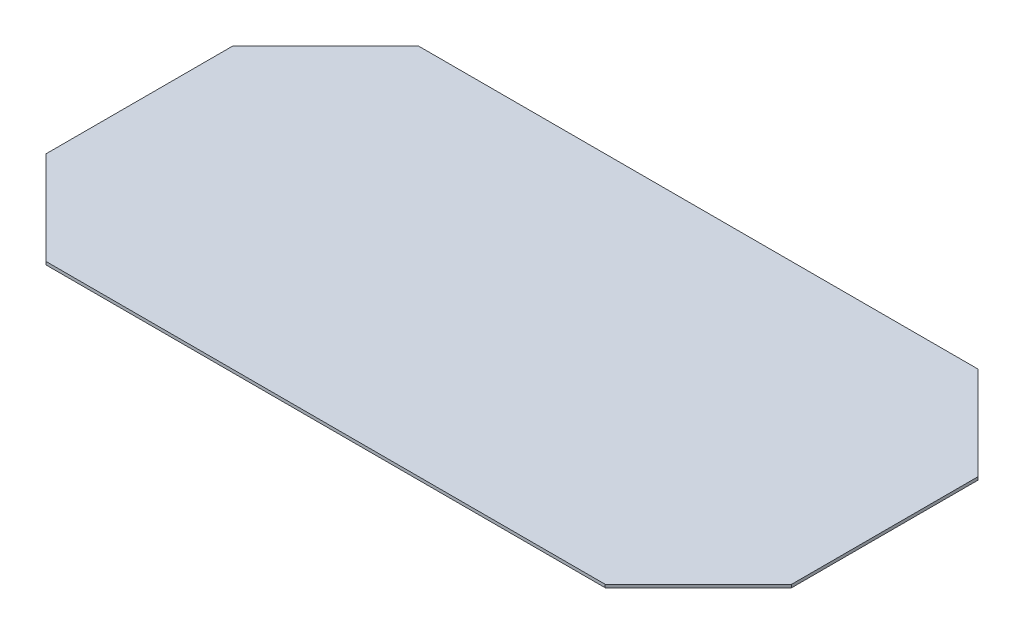
ISO-10303-21;
HEADER;
FILE_DESCRIPTION(('STEP AP214'),'2;1');
FILE_NAME('part.step','',(''),(''),'','','');
FILE_SCHEMA(('AUTOMOTIVE_DESIGN { 1 0 10303 214 1 1 1 1 }'));
ENDSEC;
DATA;
#1=APPLICATION_CONTEXT('core data for automotive mechanical design processes');
#2=APPLICATION_PROTOCOL_DEFINITION('international standard','automotive_design',2000,#1);
#3=PRODUCT_CONTEXT('',#1,'mechanical');
#4=PRODUCT('Part','Part','',(#3));
#5=PRODUCT_RELATED_PRODUCT_CATEGORY('part','',(#4));
#6=PRODUCT_DEFINITION_FORMATION('','',#4);
#7=PRODUCT_DEFINITION_CONTEXT('part definition',#1,'design');
#8=PRODUCT_DEFINITION('design','',#6,#7);
#9=PRODUCT_DEFINITION_SHAPE('','',#8);
#10=(LENGTH_UNIT() NAMED_UNIT(*) SI_UNIT(.MILLI.,.METRE.));
#11=(NAMED_UNIT(*) PLANE_ANGLE_UNIT() SI_UNIT($,.RADIAN.));
#12=(NAMED_UNIT(*) SI_UNIT($,.STERADIAN.) SOLID_ANGLE_UNIT());
#13=UNCERTAINTY_MEASURE_WITH_UNIT(LENGTH_MEASURE(1.E-05),#10,'distance_accuracy_value','');
#14=(GEOMETRIC_REPRESENTATION_CONTEXT(3) GLOBAL_UNCERTAINTY_ASSIGNED_CONTEXT((#13)) GLOBAL_UNIT_ASSIGNED_CONTEXT((#10,
#11,#12)) REPRESENTATION_CONTEXT('',''));
#15=CARTESIAN_POINT('',(0.,0.,0.));
#16=DIRECTION('',(0.,0.,1.));
#17=DIRECTION('',(1.,0.,0.));
#18=AXIS2_PLACEMENT_3D('',#15,#16,#17);
#19=CARTESIAN_POINT('',(123.19,1.,-61.595));
#20=DIRECTION('',(-1.,0.,0.));
#21=DIRECTION('',(0.,0.,1.));
#22=AXIS2_PLACEMENT_3D('',#19,#20,#21);
#23=PLANE('',#22);
#24=DIRECTION('',(0.,0.,-1.));
#25=VECTOR('',#24,1.);
#26=CARTESIAN_POINT('',(123.19,1.,-61.595));
#27=LINE('',#26,#25);
#28=CARTESIAN_POINT('',(123.19,1.,30.7975));
#29=VERTEX_POINT('',#28);
#30=CARTESIAN_POINT('',(123.19,1.,-30.7974999999999));
#31=VERTEX_POINT('',#30);
#32=EDGE_CURVE('E117',#29,#31,#27,.T.);
#33=ORIENTED_EDGE('',*,*,#32,.F.);
#34=DIRECTION('',(0.,-1.,0.));
#35=VECTOR('',#34,1.);
#36=CARTESIAN_POINT('',(123.19,1.,30.7975));
#37=LINE('',#36,#35);
#38=CARTESIAN_POINT('',(123.19,0.,30.7975));
#39=VERTEX_POINT('',#38);
#40=EDGE_CURVE('E102',#29,#39,#37,.T.);
#41=ORIENTED_EDGE('',*,*,#40,.T.);
#42=DIRECTION('',(0.,0.,-1.));
#43=VECTOR('',#42,1.);
#44=CARTESIAN_POINT('',(123.19,0.,-61.595));
#45=LINE('',#44,#43);
#46=CARTESIAN_POINT('',(123.19,0.,-30.7974999999999));
#47=VERTEX_POINT('',#46);
#48=EDGE_CURVE('E114',#39,#47,#45,.T.);
#49=ORIENTED_EDGE('',*,*,#48,.T.);
#50=DIRECTION('',(0.,1.,0.));
#51=VECTOR('',#50,1.);
#52=CARTESIAN_POINT('',(123.19,1.,-30.7974999999999));
#53=LINE('',#52,#51);
#54=EDGE_CURVE('E119',#47,#31,#53,.T.);
#55=ORIENTED_EDGE('',*,*,#54,.T.);
#56=EDGE_LOOP('',(#33,#41,#49,#55));
#57=FACE_BOUND('',#56,.T.);
#58=ADVANCED_FACE('F33',(#57),#23,.F.);
#59=CARTESIAN_POINT('',(-123.19,1.,-61.595));
#60=DIRECTION('',(0.,0.,1.));
#61=DIRECTION('',(1.,0.,0.));
#62=AXIS2_PLACEMENT_3D('',#59,#60,#61);
#63=PLANE('',#62);
#64=DIRECTION('',(-1.,0.,0.));
#65=VECTOR('',#64,1.);
#66=CARTESIAN_POINT('',(-123.19,1.,-61.595));
#67=LINE('',#66,#65);
#68=CARTESIAN_POINT('',(92.3924999999999,1.,-61.595));
#69=VERTEX_POINT('',#68);
#70=CARTESIAN_POINT('',(-92.3924999999999,1.,-61.595));
#71=VERTEX_POINT('',#70);
#72=EDGE_CURVE('E168',#69,#71,#67,.T.);
#73=ORIENTED_EDGE('',*,*,#72,.F.);
#74=DIRECTION('',(0.,-1.,0.));
#75=VECTOR('',#74,1.);
#76=CARTESIAN_POINT('',(92.3925,1.,-61.595));
#77=LINE('',#76,#75);
#78=CARTESIAN_POINT('',(92.3924999999999,0.,-61.595));
#79=VERTEX_POINT('',#78);
#80=EDGE_CURVE('E152',#69,#79,#77,.T.);
#81=ORIENTED_EDGE('',*,*,#80,.T.);
#82=DIRECTION('',(-1.,0.,0.));
#83=VECTOR('',#82,1.);
#84=CARTESIAN_POINT('',(-123.19,0.,-61.595));
#85=LINE('',#84,#83);
#86=CARTESIAN_POINT('',(-92.3924999999999,0.,-61.595));
#87=VERTEX_POINT('',#86);
#88=EDGE_CURVE('E123',#79,#87,#85,.T.);
#89=ORIENTED_EDGE('',*,*,#88,.T.);
#90=DIRECTION('',(0.,1.,0.));
#91=VECTOR('',#90,1.);
#92=CARTESIAN_POINT('',(-92.3924999999999,1.,-61.595));
#93=LINE('',#92,#91);
#94=EDGE_CURVE('E150',#87,#71,#93,.T.);
#95=ORIENTED_EDGE('',*,*,#94,.T.);
#96=EDGE_LOOP('',(#73,#81,#89,#95));
#97=FACE_BOUND('',#96,.T.);
#98=ADVANCED_FACE('F178',(#97),#63,.F.);
#99=CARTESIAN_POINT('',(-123.19,1.,-61.595));
#100=DIRECTION('',(1.,0.,0.));
#101=DIRECTION('',(0.,0.,-1.));
#102=AXIS2_PLACEMENT_3D('',#99,#100,#101);
#103=PLANE('',#102);
#104=DIRECTION('',(0.,0.,1.));
#105=VECTOR('',#104,1.);
#106=CARTESIAN_POINT('',(-123.19,0.,-61.595));
#107=LINE('',#106,#105);
#108=CARTESIAN_POINT('',(-123.19,0.,-30.7975));
#109=VERTEX_POINT('',#108);
#110=CARTESIAN_POINT('',(-123.19,0.,30.7974999999999));
#111=VERTEX_POINT('',#110);
#112=EDGE_CURVE('E126',#109,#111,#107,.T.);
#113=ORIENTED_EDGE('',*,*,#112,.T.);
#114=DIRECTION('',(0.,1.,0.));
#115=VECTOR('',#114,1.);
#116=CARTESIAN_POINT('',(-123.19,1.,30.7974999999999));
#117=LINE('',#116,#115);
#118=CARTESIAN_POINT('',(-123.19,1.,30.7974999999999));
#119=VERTEX_POINT('',#118);
#120=EDGE_CURVE('E11',#111,#119,#117,.T.);
#121=ORIENTED_EDGE('',*,*,#120,.T.);
#122=DIRECTION('',(0.,0.,1.));
#123=VECTOR('',#122,1.);
#124=CARTESIAN_POINT('',(-123.19,1.,-61.595));
#125=LINE('',#124,#123);
#126=CARTESIAN_POINT('',(-123.19,1.,-30.7975));
#127=VERTEX_POINT('',#126);
#128=EDGE_CURVE('E158',#127,#119,#125,.T.);
#129=ORIENTED_EDGE('',*,*,#128,.F.);
#130=DIRECTION('',(0.,-1.,0.));
#131=VECTOR('',#130,1.);
#132=CARTESIAN_POINT('',(-123.19,1.,-30.7975));
#133=LINE('',#132,#131);
#134=EDGE_CURVE('E41',#127,#109,#133,.T.);
#135=ORIENTED_EDGE('',*,*,#134,.T.);
#136=EDGE_LOOP('',(#113,#121,#129,#135));
#137=FACE_BOUND('',#136,.T.);
#138=ADVANCED_FACE('F157',(#137),#103,.F.);
#139=CARTESIAN_POINT('',(-123.19,1.,61.595));
#140=DIRECTION('',(0.,0.,-1.));
#141=DIRECTION('',(-1.,0.,0.));
#142=AXIS2_PLACEMENT_3D('',#139,#140,#141);
#143=PLANE('',#142);
#144=DIRECTION('',(1.,0.,0.));
#145=VECTOR('',#144,1.);
#146=CARTESIAN_POINT('',(-123.19,0.,61.595));
#147=LINE('',#146,#145);
#148=CARTESIAN_POINT('',(-92.3925,0.,61.595));
#149=VERTEX_POINT('',#148);
#150=CARTESIAN_POINT('',(92.3924999999998,0.,61.595));
#151=VERTEX_POINT('',#150);
#152=EDGE_CURVE('E133',#149,#151,#147,.T.);
#153=ORIENTED_EDGE('',*,*,#152,.T.);
#154=DIRECTION('',(0.,1.,0.));
#155=VECTOR('',#154,1.);
#156=CARTESIAN_POINT('',(92.3924999999999,1.,61.595));
#157=LINE('',#156,#155);
#158=CARTESIAN_POINT('',(92.3924999999998,1.,61.595));
#159=VERTEX_POINT('',#158);
#160=EDGE_CURVE('E103',#151,#159,#157,.T.);
#161=ORIENTED_EDGE('',*,*,#160,.T.);
#162=DIRECTION('',(1.,0.,0.));
#163=VECTOR('',#162,1.);
#164=CARTESIAN_POINT('',(-123.19,1.,61.595));
#165=LINE('',#164,#163);
#166=CARTESIAN_POINT('',(-92.3925,1.,61.595));
#167=VERTEX_POINT('',#166);
#168=EDGE_CURVE('E129',#167,#159,#165,.T.);
#169=ORIENTED_EDGE('',*,*,#168,.F.);
#170=DIRECTION('',(0.,-1.,0.));
#171=VECTOR('',#170,1.);
#172=CARTESIAN_POINT('',(-92.3925,1.,61.595));
#173=LINE('',#172,#171);
#174=EDGE_CURVE('E108',#167,#149,#173,.T.);
#175=ORIENTED_EDGE('',*,*,#174,.T.);
#176=EDGE_LOOP('',(#153,#161,#169,#175));
#177=FACE_BOUND('',#176,.T.);
#178=ADVANCED_FACE('F166',(#177),#143,.F.);
#179=CARTESIAN_POINT('',(0.,1.,0.));
#180=DIRECTION('',(0.,1.,0.));
#181=DIRECTION('',(0.,0.,1.));
#182=AXIS2_PLACEMENT_3D('',#179,#180,#181);
#183=PLANE('',#182);
#184=ORIENTED_EDGE('',*,*,#168,.T.);
#185=DIRECTION('',(-0.707106781186549,0.,0.707106781186546));
#186=VECTOR('',#185,1.);
#187=CARTESIAN_POINT('',(76.9937499999997,1.,76.9937500000001));
#188=LINE('',#187,#186);
#189=EDGE_CURVE('E148',#159,#29,#188,.F.);
#190=ORIENTED_EDGE('',*,*,#189,.T.);
#191=ORIENTED_EDGE('',*,*,#32,.T.);
#192=DIRECTION('',(0.707106781186547,0.,0.707106781186548));
#193=VECTOR('',#192,1.);
#194=CARTESIAN_POINT('',(76.9937500000001,1.,-76.9937499999999));
#195=LINE('',#194,#193);
#196=EDGE_CURVE('E146',#31,#69,#195,.F.);
#197=ORIENTED_EDGE('',*,*,#196,.T.);
#198=ORIENTED_EDGE('',*,*,#72,.T.);
#199=DIRECTION('',(0.707106781186549,0.,-0.707106781186546));
#200=VECTOR('',#199,1.);
#201=CARTESIAN_POINT('',(-76.9937499999997,1.,-76.9937500000001));
#202=LINE('',#201,#200);
#203=EDGE_CURVE('E53',#71,#127,#202,.F.);
#204=ORIENTED_EDGE('',*,*,#203,.T.);
#205=ORIENTED_EDGE('',*,*,#128,.T.);
#206=DIRECTION('',(-0.707106781186547,0.,-0.707106781186548));
#207=VECTOR('',#206,1.);
#208=CARTESIAN_POINT('',(-76.9937500000001,1.,76.9937499999999));
#209=LINE('',#208,#207);
#210=EDGE_CURVE('E144',#119,#167,#209,.F.);
#211=ORIENTED_EDGE('',*,*,#210,.T.);
#212=EDGE_LOOP('',(#184,#190,#191,#197,#198,#204,#205,#211));
#213=FACE_BOUND('',#212,.T.);
#214=ADVANCED_FACE('F172',(#213),#183,.T.);
#215=CARTESIAN_POINT('',(0.,0.,0.));
#216=DIRECTION('',(0.,1.,0.));
#217=DIRECTION('',(0.,0.,1.));
#218=AXIS2_PLACEMENT_3D('',#215,#216,#217);
#219=PLANE('',#218);
#220=ORIENTED_EDGE('',*,*,#48,.F.);
#221=DIRECTION('',(0.707106781186549,0.,-0.707106781186546));
#222=VECTOR('',#221,1.);
#223=CARTESIAN_POINT('',(123.19,0.,30.7975));
#224=LINE('',#223,#222);
#225=EDGE_CURVE('E98',#39,#151,#224,.F.);
#226=ORIENTED_EDGE('',*,*,#225,.T.);
#227=ORIENTED_EDGE('',*,*,#152,.F.);
#228=DIRECTION('',(0.707106781186547,0.,0.707106781186548));
#229=VECTOR('',#228,1.);
#230=CARTESIAN_POINT('',(-92.3925,0.,61.595));
#231=LINE('',#230,#229);
#232=EDGE_CURVE('E137',#149,#111,#231,.F.);
#233=ORIENTED_EDGE('',*,*,#232,.T.);
#234=ORIENTED_EDGE('',*,*,#112,.F.);
#235=DIRECTION('',(-0.707106781186549,0.,0.707106781186546));
#236=VECTOR('',#235,1.);
#237=CARTESIAN_POINT('',(-123.19,0.,-30.7975));
#238=LINE('',#237,#236);
#239=EDGE_CURVE('E118',#109,#87,#238,.F.);
#240=ORIENTED_EDGE('',*,*,#239,.T.);
#241=ORIENTED_EDGE('',*,*,#88,.F.);
#242=DIRECTION('',(-0.707106781186547,0.,-0.707106781186548));
#243=VECTOR('',#242,1.);
#244=CARTESIAN_POINT('',(92.3925,0.,-61.595));
#245=LINE('',#244,#243);
#246=EDGE_CURVE('E109',#79,#47,#245,.F.);
#247=ORIENTED_EDGE('',*,*,#246,.T.);
#248=EDGE_LOOP('',(#220,#226,#227,#233,#234,#240,#241,#247));
#249=FACE_BOUND('',#248,.T.);
#250=ADVANCED_FACE('F121',(#249),#219,.F.);
#251=CARTESIAN_POINT('',(123.19,1.,30.7975));
#252=DIRECTION('',(-0.707106781186546,0.,-0.707106781186549));
#253=DIRECTION('',(0.,-1.,0.));
#254=AXIS2_PLACEMENT_3D('',#251,#252,#253);
#255=PLANE('',#254);
#256=ORIENTED_EDGE('',*,*,#189,.F.);
#257=ORIENTED_EDGE('',*,*,#160,.F.);
#258=ORIENTED_EDGE('',*,*,#225,.F.);
#259=ORIENTED_EDGE('',*,*,#40,.F.);
#260=EDGE_LOOP('',(#256,#257,#258,#259));
#261=FACE_BOUND('',#260,.T.);
#262=ADVANCED_FACE('F101',(#261),#255,.F.);
#263=CARTESIAN_POINT('',(92.3925,1.,-61.595));
#264=DIRECTION('',(-0.707106781186548,0.,0.707106781186547));
#265=DIRECTION('',(0.,-1.,0.));
#266=AXIS2_PLACEMENT_3D('',#263,#264,#265);
#267=PLANE('',#266);
#268=ORIENTED_EDGE('',*,*,#196,.F.);
#269=ORIENTED_EDGE('',*,*,#54,.F.);
#270=ORIENTED_EDGE('',*,*,#246,.F.);
#271=ORIENTED_EDGE('',*,*,#80,.F.);
#272=EDGE_LOOP('',(#268,#269,#270,#271));
#273=FACE_BOUND('',#272,.T.);
#274=ADVANCED_FACE('F176',(#273),#267,.F.);
#275=CARTESIAN_POINT('',(-92.3925,1.,61.595));
#276=DIRECTION('',(0.707106781186548,0.,-0.707106781186547));
#277=DIRECTION('',(0.,-1.,0.));
#278=AXIS2_PLACEMENT_3D('',#275,#276,#277);
#279=PLANE('',#278);
#280=ORIENTED_EDGE('',*,*,#210,.F.);
#281=ORIENTED_EDGE('',*,*,#120,.F.);
#282=ORIENTED_EDGE('',*,*,#232,.F.);
#283=ORIENTED_EDGE('',*,*,#174,.F.);
#284=EDGE_LOOP('',(#280,#281,#282,#283));
#285=FACE_BOUND('',#284,.T.);
#286=ADVANCED_FACE('F163',(#285),#279,.F.);
#287=CARTESIAN_POINT('',(-123.19,1.,-30.7975));
#288=DIRECTION('',(0.707106781186546,0.,0.707106781186549));
#289=DIRECTION('',(0.,-1.,0.));
#290=AXIS2_PLACEMENT_3D('',#287,#288,#289);
#291=PLANE('',#290);
#292=ORIENTED_EDGE('',*,*,#203,.F.);
#293=ORIENTED_EDGE('',*,*,#94,.F.);
#294=ORIENTED_EDGE('',*,*,#239,.F.);
#295=ORIENTED_EDGE('',*,*,#134,.F.);
#296=EDGE_LOOP('',(#292,#293,#294,#295));
#297=FACE_BOUND('',#296,.T.);
#298=ADVANCED_FACE('F35',(#297),#291,.F.);
#299=CLOSED_SHELL('',(#58,#98,#138,#178,#214,#250,#262,#274,#286,#298));
#300=MANIFOLD_SOLID_BREP('B2',#299);
#301=ADVANCED_BREP_SHAPE_REPRESENTATION('',(#18,#300),#14);
#302=SHAPE_DEFINITION_REPRESENTATION(#9,#301);
ENDSEC;
END-ISO-10303-21;
